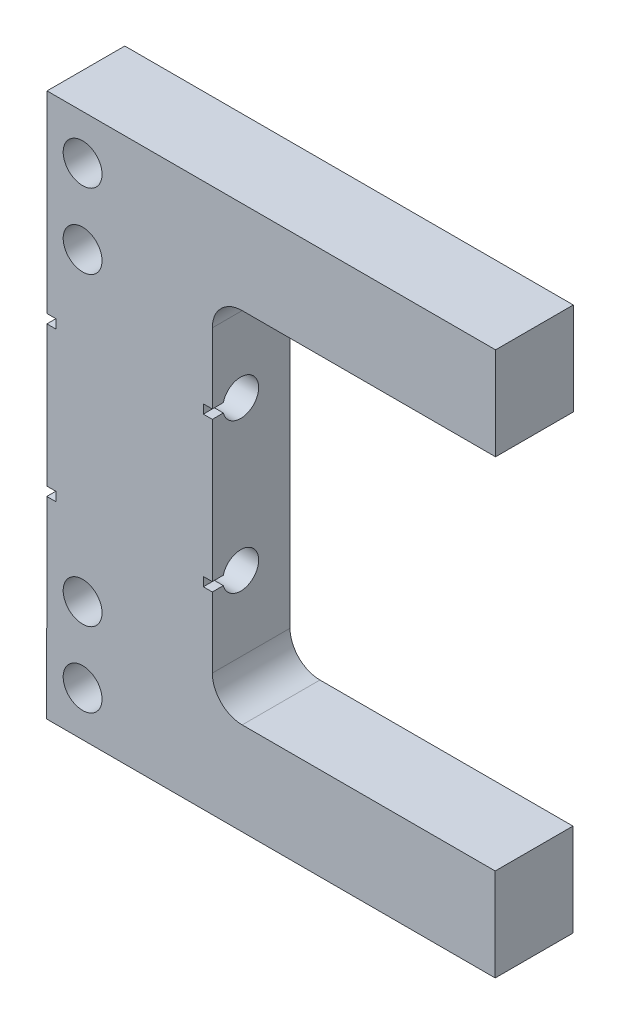
ISO-10303-21;
HEADER;
FILE_DESCRIPTION(('STEP AP214'),'2;1');
FILE_NAME('part.step','',(''),(''),'','','');
FILE_SCHEMA(('AUTOMOTIVE_DESIGN { 1 0 10303 214 1 1 1 1 }'));
ENDSEC;
DATA;
#1=APPLICATION_CONTEXT('core data for automotive mechanical design processes');
#2=APPLICATION_PROTOCOL_DEFINITION('international standard','automotive_design',2000,#1);
#3=PRODUCT_CONTEXT('',#1,'mechanical');
#4=PRODUCT('Part','Part','',(#3));
#5=PRODUCT_RELATED_PRODUCT_CATEGORY('part','',(#4));
#6=PRODUCT_DEFINITION_FORMATION('','',#4);
#7=PRODUCT_DEFINITION_CONTEXT('part definition',#1,'design');
#8=PRODUCT_DEFINITION('design','',#6,#7);
#9=PRODUCT_DEFINITION_SHAPE('','',#8);
#10=(LENGTH_UNIT() NAMED_UNIT(*) SI_UNIT(.MILLI.,.METRE.));
#11=(NAMED_UNIT(*) PLANE_ANGLE_UNIT() SI_UNIT($,.RADIAN.));
#12=(NAMED_UNIT(*) SI_UNIT($,.STERADIAN.) SOLID_ANGLE_UNIT());
#13=UNCERTAINTY_MEASURE_WITH_UNIT(LENGTH_MEASURE(1.E-05),#10,'distance_accuracy_value','');
#14=(GEOMETRIC_REPRESENTATION_CONTEXT(3) GLOBAL_UNCERTAINTY_ASSIGNED_CONTEXT((#13)) GLOBAL_UNIT_ASSIGNED_CONTEXT((#10,
#11,#12)) REPRESENTATION_CONTEXT('',''));
#15=CARTESIAN_POINT('',(0.,0.,0.));
#16=DIRECTION('',(0.,0.,1.));
#17=DIRECTION('',(1.,0.,0.));
#18=AXIS2_PLACEMENT_3D('',#15,#16,#17);
#19=CARTESIAN_POINT('',(-8.20152888113595,23.3296207262961,2.6));
#20=DIRECTION('',(0.,1.,0.));
#21=DIRECTION('',(0.,0.,1.));
#22=AXIS2_PLACEMENT_3D('',#19,#20,#21);
#23=PLANE('',#22);
#24=DIRECTION('',(1.,0.,0.));
#25=VECTOR('',#24,1.);
#26=CARTESIAN_POINT('',(-8.20152888113595,23.3296207262961,0.));
#27=LINE('',#26,#25);
#28=CARTESIAN_POINT('',(-8.20152888113595,23.3296207262961,0.));
#29=VERTEX_POINT('',#28);
#30=CARTESIAN_POINT('',(6.79847111886405,23.3296207262961,0.));
#31=VERTEX_POINT('',#30);
#32=EDGE_CURVE('E326',#29,#31,#27,.T.);
#33=ORIENTED_EDGE('',*,*,#32,.T.);
#34=DIRECTION('',(0.,0.,-1.));
#35=VECTOR('',#34,1.);
#36=CARTESIAN_POINT('',(6.79847111886405,23.3296207262961,2.6));
#37=LINE('',#36,#35);
#38=CARTESIAN_POINT('',(6.79847111886405,23.3296207262961,2.6));
#39=VERTEX_POINT('',#38);
#40=EDGE_CURVE('E432',#39,#31,#37,.T.);
#41=ORIENTED_EDGE('',*,*,#40,.F.);
#42=DIRECTION('',(1.,0.,0.));
#43=VECTOR('',#42,1.);
#44=CARTESIAN_POINT('',(-8.20152888113595,23.3296207262961,2.6));
#45=LINE('',#44,#43);
#46=CARTESIAN_POINT('',(-8.20152888113595,23.3296207262961,2.6));
#47=VERTEX_POINT('',#46);
#48=EDGE_CURVE('E356',#47,#39,#45,.T.);
#49=ORIENTED_EDGE('',*,*,#48,.F.);
#50=DIRECTION('',(0.,0.,-1.));
#51=VECTOR('',#50,1.);
#52=CARTESIAN_POINT('',(-8.20152888113595,23.3296207262961,2.6));
#53=LINE('',#52,#51);
#54=EDGE_CURVE('E386',#47,#29,#53,.T.);
#55=ORIENTED_EDGE('',*,*,#54,.T.);
#56=EDGE_LOOP('',(#33,#41,#49,#55));
#57=FACE_BOUND('',#56,.T.);
#58=ADVANCED_FACE('F36',(#57),#23,.F.);
#59=CARTESIAN_POINT('',(6.79847111886405,23.3296207262961,2.6));
#60=DIRECTION('',(-1.,0.,0.));
#61=DIRECTION('',(0.,0.,1.));
#62=AXIS2_PLACEMENT_3D('',#59,#60,#61);
#63=PLANE('',#62);
#64=DIRECTION('',(0.,1.,0.));
#65=VECTOR('',#64,1.);
#66=CARTESIAN_POINT('',(6.79847111886405,23.3296207262961,0.));
#67=LINE('',#66,#65);
#68=CARTESIAN_POINT('',(6.79847111886405,26.4296183724913,0.));
#69=VERTEX_POINT('',#68);
#70=EDGE_CURVE('E391',#31,#69,#67,.T.);
#71=ORIENTED_EDGE('',*,*,#70,.T.);
#72=DIRECTION('',(0.,0.,-1.));
#73=VECTOR('',#72,1.);
#74=CARTESIAN_POINT('',(6.79847111886405,26.4296183724913,2.6));
#75=LINE('',#74,#73);
#76=CARTESIAN_POINT('',(6.79847111886405,26.4296183724913,2.6));
#77=VERTEX_POINT('',#76);
#78=EDGE_CURVE('E428',#77,#69,#75,.T.);
#79=ORIENTED_EDGE('',*,*,#78,.F.);
#80=DIRECTION('',(0.,1.,0.));
#81=VECTOR('',#80,1.);
#82=CARTESIAN_POINT('',(6.79847111886405,23.3296207262961,2.6));
#83=LINE('',#82,#81);
#84=EDGE_CURVE('E360',#39,#77,#83,.T.);
#85=ORIENTED_EDGE('',*,*,#84,.F.);
#86=ORIENTED_EDGE('',*,*,#40,.T.);
#87=EDGE_LOOP('',(#71,#79,#85,#86));
#88=FACE_BOUND('',#87,.T.);
#89=ADVANCED_FACE('F564',(#88),#63,.F.);
#90=CARTESIAN_POINT('',(6.79847111886405,26.4296183724913,2.6));
#91=DIRECTION('',(0.,-1.,0.));
#92=DIRECTION('',(1.,0.,0.));
#93=AXIS2_PLACEMENT_3D('',#90,#91,#92);
#94=PLANE('',#93);
#95=DIRECTION('',(-1.,0.,0.));
#96=VECTOR('',#95,1.);
#97=CARTESIAN_POINT('',(6.79847111886405,26.4296183724913,0.));
#98=LINE('',#97,#96);
#99=CARTESIAN_POINT('',(-1.66324686714981,26.4296183724913,0.));
#100=VERTEX_POINT('',#99);
#101=EDGE_CURVE('E394',#69,#100,#98,.T.);
#102=ORIENTED_EDGE('',*,*,#101,.T.);
#103=DIRECTION('',(0.,0.,-1.));
#104=VECTOR('',#103,1.);
#105=CARTESIAN_POINT('',(-1.66324686714981,26.4296183724913,2.6));
#106=LINE('',#105,#104);
#107=CARTESIAN_POINT('',(-1.66324686714981,26.4296183724913,2.6));
#108=VERTEX_POINT('',#107);
#109=EDGE_CURVE('E492',#100,#108,#106,.F.);
#110=ORIENTED_EDGE('',*,*,#109,.T.);
#111=DIRECTION('',(-1.,0.,0.));
#112=VECTOR('',#111,1.);
#113=CARTESIAN_POINT('',(6.79847111886405,26.4296183724913,2.6));
#114=LINE('',#113,#112);
#115=EDGE_CURVE('E364',#77,#108,#114,.T.);
#116=ORIENTED_EDGE('',*,*,#115,.F.);
#117=ORIENTED_EDGE('',*,*,#78,.T.);
#118=EDGE_LOOP('',(#102,#110,#116,#117));
#119=FACE_BOUND('',#118,.T.);
#120=ADVANCED_FACE('F573',(#119),#94,.F.);
#121=CARTESIAN_POINT('',(-2.66324686714981,26.4296183724913,2.6));
#122=DIRECTION('',(-1.,0.,0.));
#123=DIRECTION('',(0.,0.,1.));
#124=AXIS2_PLACEMENT_3D('',#121,#122,#123);
#125=PLANE('',#124);
#126=DIRECTION('',(0.,1.,0.));
#127=VECTOR('',#126,1.);
#128=CARTESIAN_POINT('',(-2.66324686714981,26.4296183724913,2.6));
#129=LINE('',#128,#127);
#130=CARTESIAN_POINT('',(-2.66324686714981,27.4296183724913,2.6));
#131=VERTEX_POINT('',#130);
#132=CARTESIAN_POINT('',(-2.66324686714981,29.7796207262961,2.6));
#133=VERTEX_POINT('',#132);
#134=EDGE_CURVE('E234',#131,#133,#129,.T.);
#135=ORIENTED_EDGE('',*,*,#134,.F.);
#136=DIRECTION('',(0.,0.,-1.));
#137=VECTOR('',#136,1.);
#138=CARTESIAN_POINT('',(-2.66324686714981,27.4296183724913,0.));
#139=LINE('',#138,#137);
#140=CARTESIAN_POINT('',(-2.66324686714981,27.4296183724913,0.));
#141=VERTEX_POINT('',#140);
#142=EDGE_CURVE('E488',#131,#141,#139,.T.);
#143=ORIENTED_EDGE('',*,*,#142,.T.);
#144=DIRECTION('',(0.,1.,0.));
#145=VECTOR('',#144,1.);
#146=CARTESIAN_POINT('',(-2.66324686714981,26.4296183724913,0.));
#147=LINE('',#146,#145);
#148=CARTESIAN_POINT('',(-2.66324686714981,37.4296183724913,0.));
#149=VERTEX_POINT('',#148);
#150=EDGE_CURVE('E398',#141,#149,#147,.T.);
#151=ORIENTED_EDGE('',*,*,#150,.T.);
#152=DIRECTION('',(0.,0.,-1.));
#153=VECTOR('',#152,1.);
#154=CARTESIAN_POINT('',(-2.66324686714981,37.4296183724913,2.6));
#155=LINE('',#154,#153);
#156=CARTESIAN_POINT('',(-2.66324686714981,37.4296183724913,2.6));
#157=VERTEX_POINT('',#156);
#158=EDGE_CURVE('E485',#149,#157,#155,.F.);
#159=ORIENTED_EDGE('',*,*,#158,.T.);
#160=CARTESIAN_POINT('',(-2.66324686714981,35.0796207262961,2.6));
#161=VERTEX_POINT('',#160);
#162=EDGE_CURVE('E368',#161,#157,#129,.T.);
#163=ORIENTED_EDGE('',*,*,#162,.F.);
#164=DIRECTION('',(0.,0.,1.));
#165=VECTOR('',#164,1.);
#166=CARTESIAN_POINT('',(-2.66324686714981,35.0796207262961,2.6));
#167=LINE('',#166,#165);
#168=CARTESIAN_POINT('',(-2.66324686714981,35.0796207262961,2.23094750193166));
#169=VERTEX_POINT('',#168);
#170=EDGE_CURVE('E251',#169,#161,#167,.T.);
#171=ORIENTED_EDGE('',*,*,#170,.F.);
#172=CARTESIAN_POINT('',(-2.66324686714981,34.9296207262961,1.65000000000056));
#173=DIRECTION('',(1.,0.,0.));
#174=DIRECTION('',(0.,1.,0.));
#175=AXIS2_PLACEMENT_3D('',#172,#173,#174);
#176=CIRCLE('',#175,0.599999999999995);
#177=CARTESIAN_POINT('',(-2.66324686714981,34.7796207262961,2.23094750193166));
#178=VERTEX_POINT('',#177);
#179=EDGE_CURVE('E314',#178,#169,#176,.T.);
#180=ORIENTED_EDGE('',*,*,#179,.F.);
#181=DIRECTION('',(0.,0.,-1.));
#182=VECTOR('',#181,1.);
#183=CARTESIAN_POINT('',(-2.66324686714981,34.7796207262961,2.6));
#184=LINE('',#183,#182);
#185=CARTESIAN_POINT('',(-2.66324686714981,34.7796207262961,2.6));
#186=VERTEX_POINT('',#185);
#187=EDGE_CURVE('E258',#186,#178,#184,.T.);
#188=ORIENTED_EDGE('',*,*,#187,.F.);
#189=CARTESIAN_POINT('',(-2.66324686714981,30.0796207262961,2.6));
#190=VERTEX_POINT('',#189);
#191=EDGE_CURVE('E372',#190,#186,#129,.T.);
#192=ORIENTED_EDGE('',*,*,#191,.F.);
#193=DIRECTION('',(0.,0.,1.));
#194=VECTOR('',#193,1.);
#195=CARTESIAN_POINT('',(-2.66324686714981,30.0796207262961,2.6));
#196=LINE('',#195,#194);
#197=CARTESIAN_POINT('',(-2.66324686714981,30.0796207262961,2.23094750193164));
#198=VERTEX_POINT('',#197);
#199=EDGE_CURVE('E229',#198,#190,#196,.T.);
#200=ORIENTED_EDGE('',*,*,#199,.F.);
#201=CARTESIAN_POINT('',(-2.66324686714981,29.9296207262961,1.65000000000053));
#202=DIRECTION('',(1.,0.,0.));
#203=DIRECTION('',(0.,1.,0.));
#204=AXIS2_PLACEMENT_3D('',#201,#202,#203);
#205=CIRCLE('',#204,0.6);
#206=CARTESIAN_POINT('',(-2.66324686714981,29.7796207262961,2.23094750193164));
#207=VERTEX_POINT('',#206);
#208=EDGE_CURVE('E290',#207,#198,#205,.T.);
#209=ORIENTED_EDGE('',*,*,#208,.F.);
#210=DIRECTION('',(0.,0.,-1.));
#211=VECTOR('',#210,1.);
#212=CARTESIAN_POINT('',(-2.66324686714981,29.7796207262961,2.6));
#213=LINE('',#212,#211);
#214=EDGE_CURVE('E267',#133,#207,#213,.T.);
#215=ORIENTED_EDGE('',*,*,#214,.F.);
#216=EDGE_LOOP('',(#135,#143,#151,#159,#163,#171,#180,#188,#192,#200,#209,#215));
#217=FACE_BOUND('',#216,.T.);
#218=ADVANCED_FACE('F512',(#217),#125,.F.);
#219=CARTESIAN_POINT('',(-2.66324686714981,38.4296183724913,2.6));
#220=DIRECTION('',(0.,1.,0.));
#221=DIRECTION('',(0.,0.,1.));
#222=AXIS2_PLACEMENT_3D('',#219,#220,#221);
#223=PLANE('',#222);
#224=DIRECTION('',(1.,0.,0.));
#225=VECTOR('',#224,1.);
#226=CARTESIAN_POINT('',(-2.66324686714981,38.4296183724913,2.6));
#227=LINE('',#226,#225);
#228=CARTESIAN_POINT('',(-1.66324686714981,38.4296183724913,2.6));
#229=VERTEX_POINT('',#228);
#230=CARTESIAN_POINT('',(6.81032261623043,38.4296183724913,2.6));
#231=VERTEX_POINT('',#230);
#232=EDGE_CURVE('E371',#229,#231,#227,.T.);
#233=ORIENTED_EDGE('',*,*,#232,.F.);
#234=DIRECTION('',(0.,0.,-1.));
#235=VECTOR('',#234,1.);
#236=CARTESIAN_POINT('',(-1.66324686714981,38.4296183724913,0.));
#237=LINE('',#236,#235);
#238=CARTESIAN_POINT('',(-1.66324686714981,38.4296183724913,0.));
#239=VERTEX_POINT('',#238);
#240=EDGE_CURVE('E495',#229,#239,#237,.T.);
#241=ORIENTED_EDGE('',*,*,#240,.T.);
#242=DIRECTION('',(1.,0.,0.));
#243=VECTOR('',#242,1.);
#244=CARTESIAN_POINT('',(-2.66324686714981,38.4296183724913,0.));
#245=LINE('',#244,#243);
#246=CARTESIAN_POINT('',(6.81032261623043,38.4296183724913,0.));
#247=VERTEX_POINT('',#246);
#248=EDGE_CURVE('E402',#239,#247,#245,.T.);
#249=ORIENTED_EDGE('',*,*,#248,.T.);
#250=DIRECTION('',(0.,0.,-1.));
#251=VECTOR('',#250,1.);
#252=CARTESIAN_POINT('',(6.81032261623043,38.4296183724913,2.6));
#253=LINE('',#252,#251);
#254=EDGE_CURVE('E424',#231,#247,#253,.T.);
#255=ORIENTED_EDGE('',*,*,#254,.F.);
#256=EDGE_LOOP('',(#233,#241,#249,#255));
#257=FACE_BOUND('',#256,.T.);
#258=ADVANCED_FACE('F516',(#257),#223,.F.);
#259=CARTESIAN_POINT('',(6.81032261623043,38.4296183724913,2.6));
#260=DIRECTION('',(-1.,0.,0.));
#261=DIRECTION('',(0.,0.,1.));
#262=AXIS2_PLACEMENT_3D('',#259,#260,#261);
#263=PLANE('',#262);
#264=DIRECTION('',(0.,1.,0.));
#265=VECTOR('',#264,1.);
#266=CARTESIAN_POINT('',(6.81032261623043,38.4296183724913,0.));
#267=LINE('',#266,#265);
#268=CARTESIAN_POINT('',(6.81032261623043,41.5296207262961,0.));
#269=VERTEX_POINT('',#268);
#270=EDGE_CURVE('E405',#247,#269,#267,.T.);
#271=ORIENTED_EDGE('',*,*,#270,.T.);
#272=DIRECTION('',(0.,0.,-1.));
#273=VECTOR('',#272,1.);
#274=CARTESIAN_POINT('',(6.81032261623043,41.5296207262961,2.6));
#275=LINE('',#274,#273);
#276=CARTESIAN_POINT('',(6.81032261623043,41.5296207262961,2.6));
#277=VERTEX_POINT('',#276);
#278=EDGE_CURVE('E420',#277,#269,#275,.T.);
#279=ORIENTED_EDGE('',*,*,#278,.F.);
#280=DIRECTION('',(0.,1.,0.));
#281=VECTOR('',#280,1.);
#282=CARTESIAN_POINT('',(6.81032261623043,38.4296183724913,2.6));
#283=LINE('',#282,#281);
#284=EDGE_CURVE('E375',#231,#277,#283,.T.);
#285=ORIENTED_EDGE('',*,*,#284,.F.);
#286=ORIENTED_EDGE('',*,*,#254,.T.);
#287=EDGE_LOOP('',(#271,#279,#285,#286));
#288=FACE_BOUND('',#287,.T.);
#289=ADVANCED_FACE('F523',(#288),#263,.F.);
#290=CARTESIAN_POINT('',(6.81032261623043,41.5296207262961,2.6));
#291=DIRECTION('',(0.,-1.,0.));
#292=DIRECTION('',(0.,0.,-1.));
#293=AXIS2_PLACEMENT_3D('',#290,#291,#292);
#294=PLANE('',#293);
#295=DIRECTION('',(-1.,0.,0.));
#296=VECTOR('',#295,1.);
#297=CARTESIAN_POINT('',(6.81032261623043,41.5296207262961,0.));
#298=LINE('',#297,#296);
#299=CARTESIAN_POINT('',(-8.18967738376956,41.5296207262961,0.));
#300=VERTEX_POINT('',#299);
#301=EDGE_CURVE('E408',#269,#300,#298,.T.);
#302=ORIENTED_EDGE('',*,*,#301,.T.);
#303=DIRECTION('',(0.,0.,-1.));
#304=VECTOR('',#303,1.);
#305=CARTESIAN_POINT('',(-8.18967738376956,41.5296207262961,2.6));
#306=LINE('',#305,#304);
#307=CARTESIAN_POINT('',(-8.18967738376956,41.5296207262961,2.6));
#308=VERTEX_POINT('',#307);
#309=EDGE_CURVE('E416',#308,#300,#306,.T.);
#310=ORIENTED_EDGE('',*,*,#309,.F.);
#311=DIRECTION('',(-1.,0.,0.));
#312=VECTOR('',#311,1.);
#313=CARTESIAN_POINT('',(6.81032261623043,41.5296207262961,2.6));
#314=LINE('',#313,#312);
#315=EDGE_CURVE('E378',#277,#308,#314,.T.);
#316=ORIENTED_EDGE('',*,*,#315,.F.);
#317=ORIENTED_EDGE('',*,*,#278,.T.);
#318=EDGE_LOOP('',(#302,#310,#316,#317));
#319=FACE_BOUND('',#318,.T.);
#320=ADVANCED_FACE('F526',(#319),#294,.F.);
#321=CARTESIAN_POINT('',(-8.18967738376956,41.5296207262961,2.6));
#322=DIRECTION('',(0.999999787981607,-0.000651181035914779,0.));
#323=DIRECTION('',(0.000651181035914779,0.999999787981607,0.));
#324=AXIS2_PLACEMENT_3D('',#321,#322,#323);
#325=PLANE('',#324);
#326=CARTESIAN_POINT('',(-8.19397517951781,34.9296207262961,1.65000000000056));
#327=DIRECTION('',(0.999999787981607,-0.000651181035914779,0.));
#328=DIRECTION('',(0.000651181035914779,0.999999787981607,0.));
#329=AXIS2_PLACEMENT_3D('',#326,#327,#328);
#330=ELLIPSE('',#329,0.600000127211058,0.599999999999995);
#331=CARTESIAN_POINT('',(-8.19407285576199,34.7796221574203,2.23094787144445));
#332=VERTEX_POINT('',#331);
#333=CARTESIAN_POINT('',(-8.19387750145122,35.0796220938148,2.23094714883815));
#334=VERTEX_POINT('',#333);
#335=EDGE_CURVE('E341',#332,#334,#330,.T.);
#336=ORIENTED_EDGE('',*,*,#335,.T.);
#337=DIRECTION('',(0.,0.,-1.));
#338=VECTOR('',#337,1.);
#339=CARTESIAN_POINT('',(-8.19387750145122,35.0796220938148,2.2));
#340=LINE('',#339,#338);
#341=CARTESIAN_POINT('',(-8.19387750145122,35.0796220938147,2.6));
#342=VERTEX_POINT('',#341);
#343=EDGE_CURVE('E274',#342,#334,#340,.T.);
#344=ORIENTED_EDGE('',*,*,#343,.F.);
#345=DIRECTION('',(-0.000651181035914779,-0.999999787981607,0.));
#346=VECTOR('',#345,1.);
#347=CARTESIAN_POINT('',(-8.18967738376956,41.5296207262961,2.6));
#348=LINE('',#347,#346);
#349=EDGE_CURVE('E382',#308,#342,#348,.T.);
#350=ORIENTED_EDGE('',*,*,#349,.F.);
#351=ORIENTED_EDGE('',*,*,#309,.T.);
#352=DIRECTION('',(-0.000651181035914779,-0.999999787981607,0.));
#353=VECTOR('',#352,1.);
#354=CARTESIAN_POINT('',(-8.18967738376956,41.5296207262961,0.));
#355=LINE('',#354,#353);
#356=EDGE_CURVE('E361',#300,#29,#355,.T.);
#357=ORIENTED_EDGE('',*,*,#356,.T.);
#358=ORIENTED_EDGE('',*,*,#54,.F.);
#359=CARTESIAN_POINT('',(-8.19732876094157,29.7796232175122,2.6));
#360=VERTEX_POINT('',#359);
#361=EDGE_CURVE('E381',#360,#47,#348,.T.);
#362=ORIENTED_EDGE('',*,*,#361,.F.);
#363=DIRECTION('',(0.,0.,1.));
#364=VECTOR('',#363,1.);
#365=CARTESIAN_POINT('',(-8.19732876094157,29.7796232175122,2.2));
#366=LINE('',#365,#364);
#367=CARTESIAN_POINT('',(-8.19732876094157,29.7796232175122,2.23094814515518));
#368=VERTEX_POINT('',#367);
#369=EDGE_CURVE('E241',#368,#360,#366,.T.);
#370=ORIENTED_EDGE('',*,*,#369,.F.);
#371=CARTESIAN_POINT('',(-8.1972310853877,29.9296207262961,1.65000000000053));
#372=DIRECTION('',(0.999999787981607,-0.000651181035914779,0.));
#373=DIRECTION('',(0.000651181035914779,0.999999787981607,0.));
#374=AXIS2_PLACEMENT_3D('',#371,#372,#373);
#375=ELLIPSE('',#374,0.600000127211063,0.6);
#376=CARTESIAN_POINT('',(-8.19713340663079,30.0796231539067,2.23094687511987));
#377=VERTEX_POINT('',#376);
#378=EDGE_CURVE('E318',#368,#377,#375,.T.);
#379=ORIENTED_EDGE('',*,*,#378,.T.);
#380=DIRECTION('',(0.,0.,-1.));
#381=VECTOR('',#380,1.);
#382=CARTESIAN_POINT('',(-8.19713340663079,30.0796231539067,2.2));
#383=LINE('',#382,#381);
#384=CARTESIAN_POINT('',(-8.19713340663079,30.0796231539067,2.6));
#385=VERTEX_POINT('',#384);
#386=EDGE_CURVE('E298',#385,#377,#383,.T.);
#387=ORIENTED_EDGE('',*,*,#386,.F.);
#388=CARTESIAN_POINT('',(-8.19407285576199,34.7796221574203,2.6));
#389=VERTEX_POINT('',#388);
#390=EDGE_CURVE('E387',#389,#385,#348,.T.);
#391=ORIENTED_EDGE('',*,*,#390,.F.);
#392=DIRECTION('',(0.,0.,1.));
#393=VECTOR('',#392,1.);
#394=CARTESIAN_POINT('',(-8.19407285576199,34.7796221574203,2.2));
#395=LINE('',#394,#393);
#396=EDGE_CURVE('E281',#332,#389,#395,.T.);
#397=ORIENTED_EDGE('',*,*,#396,.F.);
#398=EDGE_LOOP('',(#336,#344,#350,#351,#357,#358,#362,#370,#379,#387,#391,#397));
#399=FACE_BOUND('',#398,.T.);
#400=ADVANCED_FACE('F531',(#399),#325,.F.);
#401=CARTESIAN_POINT('',(0.,0.,2.6));
#402=DIRECTION('',(0.,0.,1.));
#403=DIRECTION('',(1.,0.,0.));
#404=AXIS2_PLACEMENT_3D('',#401,#402,#403);
#405=PLANE('',#404);
#406=DIRECTION('',(1.,0.,0.));
#407=VECTOR('',#406,1.);
#408=CARTESIAN_POINT('',(-2.96324686714981,30.0796207262961,2.6));
#409=LINE('',#408,#407);
#410=CARTESIAN_POINT('',(-2.96324686714981,30.0796207262961,2.6));
#411=VERTEX_POINT('',#410);
#412=EDGE_CURVE('E236',#411,#190,#409,.T.);
#413=ORIENTED_EDGE('',*,*,#412,.T.);
#414=ORIENTED_EDGE('',*,*,#191,.T.);
#415=DIRECTION('',(1.,0.,0.));
#416=VECTOR('',#415,1.);
#417=CARTESIAN_POINT('',(-2.96324686714981,34.7796207262961,2.6));
#418=LINE('',#417,#416);
#419=CARTESIAN_POINT('',(-2.96324686714981,34.7796207262961,2.6));
#420=VERTEX_POINT('',#419);
#421=EDGE_CURVE('E257',#420,#186,#418,.T.);
#422=ORIENTED_EDGE('',*,*,#421,.F.);
#423=DIRECTION('',(0.,-1.,0.));
#424=VECTOR('',#423,1.);
#425=CARTESIAN_POINT('',(-2.96324686714981,34.7796207262961,2.6));
#426=LINE('',#425,#424);
#427=CARTESIAN_POINT('',(-2.96324686714981,35.0796207262961,2.6));
#428=VERTEX_POINT('',#427);
#429=EDGE_CURVE('E246',#428,#420,#426,.T.);
#430=ORIENTED_EDGE('',*,*,#429,.F.);
#431=DIRECTION('',(1.,0.,0.));
#432=VECTOR('',#431,1.);
#433=CARTESIAN_POINT('',(-2.96324686714981,35.0796207262961,2.6));
#434=LINE('',#433,#432);
#435=EDGE_CURVE('E263',#428,#161,#434,.T.);
#436=ORIENTED_EDGE('',*,*,#435,.T.);
#437=ORIENTED_EDGE('',*,*,#162,.T.);
#438=CARTESIAN_POINT('',(-1.66324686714981,37.4296183724913,2.6));
#439=DIRECTION('',(0.,0.,1.));
#440=DIRECTION('',(1.,0.,0.));
#441=AXIS2_PLACEMENT_3D('',#438,#439,#440);
#442=CIRCLE('',#441,1.);
#443=EDGE_CURVE('E11',#157,#229,#442,.F.);
#444=ORIENTED_EDGE('',*,*,#443,.T.);
#445=ORIENTED_EDGE('',*,*,#232,.T.);
#446=ORIENTED_EDGE('',*,*,#284,.T.);
#447=ORIENTED_EDGE('',*,*,#315,.T.);
#448=ORIENTED_EDGE('',*,*,#349,.T.);
#449=DIRECTION('',(-0.999999787981607,0.000651181035914779,0.));
#450=VECTOR('',#449,1.);
#451=CARTESIAN_POINT('',(-7.89387756505674,35.079426739504,2.6));
#452=LINE('',#451,#450);
#453=CARTESIAN_POINT('',(-7.89387756505674,35.079426739504,2.6));
#454=VERTEX_POINT('',#453);
#455=EDGE_CURVE('E287',#454,#342,#452,.T.);
#456=ORIENTED_EDGE('',*,*,#455,.F.);
#457=DIRECTION('',(0.000651181035916267,0.999999787981607,0.));
#458=VECTOR('',#457,1.);
#459=CARTESIAN_POINT('',(-7.89387756505674,35.079426739504,2.6));
#460=LINE('',#459,#458);
#461=CARTESIAN_POINT('',(-7.89407291936751,34.7794268031095,2.6));
#462=VERTEX_POINT('',#461);
#463=EDGE_CURVE('E273',#462,#454,#460,.T.);
#464=ORIENTED_EDGE('',*,*,#463,.F.);
#465=DIRECTION('',(-0.999999787981607,0.000651181035914779,0.));
#466=VECTOR('',#465,1.);
#467=CARTESIAN_POINT('',(-7.89407291936751,34.7794268031095,2.6));
#468=LINE('',#467,#466);
#469=EDGE_CURVE('E280',#462,#389,#468,.T.);
#470=ORIENTED_EDGE('',*,*,#469,.T.);
#471=ORIENTED_EDGE('',*,*,#390,.T.);
#472=DIRECTION('',(-0.999999787981607,0.000651181035914779,0.));
#473=VECTOR('',#472,1.);
#474=CARTESIAN_POINT('',(-7.89713347023631,30.0794277995959,2.6));
#475=LINE('',#474,#473);
#476=CARTESIAN_POINT('',(-7.89713347023631,30.0794277995959,2.6));
#477=VERTEX_POINT('',#476);
#478=EDGE_CURVE('E284',#477,#385,#475,.T.);
#479=ORIENTED_EDGE('',*,*,#478,.F.);
#480=DIRECTION('',(0.000651181035916236,0.999999787981607,0.));
#481=VECTOR('',#480,1.);
#482=CARTESIAN_POINT('',(-7.89713347023631,30.0794277995959,2.6));
#483=LINE('',#482,#481);
#484=CARTESIAN_POINT('',(-7.89732882454709,29.7794278632015,2.6));
#485=VERTEX_POINT('',#484);
#486=EDGE_CURVE('E297',#485,#477,#483,.T.);
#487=ORIENTED_EDGE('',*,*,#486,.F.);
#488=DIRECTION('',(-0.999999787981607,0.000651181035914779,0.));
#489=VECTOR('',#488,1.);
#490=CARTESIAN_POINT('',(-7.89732882454709,29.7794278632015,2.6));
#491=LINE('',#490,#489);
#492=EDGE_CURVE('E304',#485,#360,#491,.T.);
#493=ORIENTED_EDGE('',*,*,#492,.T.);
#494=ORIENTED_EDGE('',*,*,#361,.T.);
#495=ORIENTED_EDGE('',*,*,#48,.T.);
#496=ORIENTED_EDGE('',*,*,#84,.T.);
#497=ORIENTED_EDGE('',*,*,#115,.T.);
#498=CARTESIAN_POINT('',(-1.66324686714981,27.4296183724913,2.6));
#499=DIRECTION('',(0.,0.,1.));
#500=DIRECTION('',(1.,0.,0.));
#501=AXIS2_PLACEMENT_3D('',#498,#499,#500);
#502=CIRCLE('',#501,1.);
#503=EDGE_CURVE('E501',#108,#131,#502,.F.);
#504=ORIENTED_EDGE('',*,*,#503,.T.);
#505=ORIENTED_EDGE('',*,*,#134,.T.);
#506=DIRECTION('',(1.,0.,0.));
#507=VECTOR('',#506,1.);
#508=CARTESIAN_POINT('',(-2.96324686714981,29.7796207262961,2.6));
#509=LINE('',#508,#507);
#510=CARTESIAN_POINT('',(-2.96324686714981,29.7796207262961,2.6));
#511=VERTEX_POINT('',#510);
#512=EDGE_CURVE('E213',#511,#133,#509,.T.);
#513=ORIENTED_EDGE('',*,*,#512,.F.);
#514=DIRECTION('',(0.,-1.,0.));
#515=VECTOR('',#514,1.);
#516=CARTESIAN_POINT('',(-2.96324686714981,29.7796207262961,2.6));
#517=LINE('',#516,#515);
#518=EDGE_CURVE('E221',#411,#511,#517,.T.);
#519=ORIENTED_EDGE('',*,*,#518,.F.);
#520=EDGE_LOOP('',(#413,#414,#422,#430,#436,#437,#444,#445,#446,#447,#448,#456,#464,#470,#471,
#479,#487,#493,#494,#495,#496,#497,#504,#505,#513,#519));
#521=FACE_BOUND('',#520,.T.);
#522=CARTESIAN_POINT('',(-7.00055210937498,24.8296207262961,2.6));
#523=DIRECTION('',(0.,0.,1.));
#524=DIRECTION('',(1.,0.,0.));
#525=AXIS2_PLACEMENT_3D('',#522,#523,#524);
#526=CIRCLE('',#525,0.65);
#527=CARTESIAN_POINT('',(-6.35055210937498,24.8296207262961,2.6));
#528=VERTEX_POINT('',#527);
#529=EDGE_CURVE('E327',#528,#528,#526,.T.);
#530=ORIENTED_EDGE('',*,*,#529,.F.);
#531=EDGE_LOOP('',(#530));
#532=FACE_BOUND('',#531,.T.);
#533=CARTESIAN_POINT('',(-7.00055210937499,37.5296207262961,2.6));
#534=DIRECTION('',(0.,0.,1.));
#535=DIRECTION('',(1.,0.,0.));
#536=AXIS2_PLACEMENT_3D('',#533,#534,#535);
#537=CIRCLE('',#536,0.649999999999999);
#538=CARTESIAN_POINT('',(-6.35055210937499,37.5296207262961,2.6));
#539=VERTEX_POINT('',#538);
#540=EDGE_CURVE('E337',#539,#539,#537,.T.);
#541=ORIENTED_EDGE('',*,*,#540,.F.);
#542=EDGE_LOOP('',(#541));
#543=FACE_BOUND('',#542,.T.);
#544=CARTESIAN_POINT('',(-7.00055210937499,40.0296207262961,2.6));
#545=DIRECTION('',(0.,0.,1.));
#546=DIRECTION('',(1.,0.,0.));
#547=AXIS2_PLACEMENT_3D('',#544,#545,#546);
#548=CIRCLE('',#547,0.649999999999999);
#549=CARTESIAN_POINT('',(-6.35055210937499,40.0296207262961,2.6));
#550=VERTEX_POINT('',#549);
#551=EDGE_CURVE('E336',#550,#550,#548,.T.);
#552=ORIENTED_EDGE('',*,*,#551,.F.);
#553=EDGE_LOOP('',(#552));
#554=FACE_BOUND('',#553,.T.);
#555=CARTESIAN_POINT('',(-7.00055210937498,27.3296207262961,2.6));
#556=DIRECTION('',(0.,0.,1.));
#557=DIRECTION('',(1.,0.,0.));
#558=AXIS2_PLACEMENT_3D('',#555,#556,#557);
#559=CIRCLE('',#558,0.65);
#560=CARTESIAN_POINT('',(-6.35055210937498,27.3296207262961,2.6));
#561=VERTEX_POINT('',#560);
#562=EDGE_CURVE('E345',#561,#561,#559,.T.);
#563=ORIENTED_EDGE('',*,*,#562,.F.);
#564=EDGE_LOOP('',(#563));
#565=FACE_BOUND('',#564,.T.);
#566=ADVANCED_FACE('F231',(#521,#532,#543,#554,#565),#405,.T.);
#567=CARTESIAN_POINT('',(0.,0.,0.));
#568=DIRECTION('',(0.,0.,1.));
#569=DIRECTION('',(1.,0.,0.));
#570=AXIS2_PLACEMENT_3D('',#567,#568,#569);
#571=PLANE('',#570);
#572=CARTESIAN_POINT('',(-7.00055210937498,24.8296207262961,0.));
#573=DIRECTION('',(0.,0.,1.));
#574=DIRECTION('',(1.,0.,0.));
#575=AXIS2_PLACEMENT_3D('',#572,#573,#574);
#576=CIRCLE('',#575,0.65);
#577=CARTESIAN_POINT('',(-6.35055210937498,24.8296207262961,0.));
#578=VERTEX_POINT('',#577);
#579=EDGE_CURVE('E322',#578,#578,#576,.T.);
#580=ORIENTED_EDGE('',*,*,#579,.T.);
#581=EDGE_LOOP('',(#580));
#582=FACE_BOUND('',#581,.T.);
#583=CARTESIAN_POINT('',(-7.00055210937499,37.5296207262961,0.));
#584=DIRECTION('',(0.,0.,1.));
#585=DIRECTION('',(1.,0.,0.));
#586=AXIS2_PLACEMENT_3D('',#583,#584,#585);
#587=CIRCLE('',#586,0.649999999999999);
#588=CARTESIAN_POINT('',(-6.35055210937499,37.5296207262961,0.));
#589=VERTEX_POINT('',#588);
#590=EDGE_CURVE('E332',#589,#589,#587,.T.);
#591=ORIENTED_EDGE('',*,*,#590,.T.);
#592=EDGE_LOOP('',(#591));
#593=FACE_BOUND('',#592,.T.);
#594=CARTESIAN_POINT('',(-7.00055210937499,40.0296207262961,0.));
#595=DIRECTION('',(0.,0.,1.));
#596=DIRECTION('',(1.,0.,0.));
#597=AXIS2_PLACEMENT_3D('',#594,#595,#596);
#598=CIRCLE('',#597,0.649999999999999);
#599=CARTESIAN_POINT('',(-6.35055210937499,40.0296207262961,0.));
#600=VERTEX_POINT('',#599);
#601=EDGE_CURVE('E349',#600,#600,#598,.T.);
#602=ORIENTED_EDGE('',*,*,#601,.T.);
#603=EDGE_LOOP('',(#602));
#604=FACE_BOUND('',#603,.T.);
#605=CARTESIAN_POINT('',(-7.00055210937498,27.3296207262961,0.));
#606=DIRECTION('',(0.,0.,1.));
#607=DIRECTION('',(1.,0.,0.));
#608=AXIS2_PLACEMENT_3D('',#605,#606,#607);
#609=CIRCLE('',#608,0.65);
#610=CARTESIAN_POINT('',(-6.35055210937498,27.3296207262961,0.));
#611=VERTEX_POINT('',#610);
#612=EDGE_CURVE('E331',#611,#611,#609,.T.);
#613=ORIENTED_EDGE('',*,*,#612,.T.);
#614=EDGE_LOOP('',(#613));
#615=FACE_BOUND('',#614,.T.);
#616=ORIENTED_EDGE('',*,*,#32,.F.);
#617=ORIENTED_EDGE('',*,*,#356,.F.);
#618=ORIENTED_EDGE('',*,*,#301,.F.);
#619=ORIENTED_EDGE('',*,*,#270,.F.);
#620=ORIENTED_EDGE('',*,*,#248,.F.);
#621=CARTESIAN_POINT('',(-1.66324686714981,37.4296183724913,0.));
#622=DIRECTION('',(0.,0.,1.));
#623=DIRECTION('',(1.,0.,0.));
#624=AXIS2_PLACEMENT_3D('',#621,#622,#623);
#625=CIRCLE('',#624,1.);
#626=EDGE_CURVE('E45',#239,#149,#625,.T.);
#627=ORIENTED_EDGE('',*,*,#626,.T.);
#628=ORIENTED_EDGE('',*,*,#150,.F.);
#629=CARTESIAN_POINT('',(-1.66324686714981,27.4296183724913,0.));
#630=DIRECTION('',(0.,0.,1.));
#631=DIRECTION('',(1.,0.,0.));
#632=AXIS2_PLACEMENT_3D('',#629,#630,#631);
#633=CIRCLE('',#632,1.);
#634=EDGE_CURVE('E498',#141,#100,#633,.T.);
#635=ORIENTED_EDGE('',*,*,#634,.T.);
#636=ORIENTED_EDGE('',*,*,#101,.F.);
#637=ORIENTED_EDGE('',*,*,#70,.F.);
#638=EDGE_LOOP('',(#616,#617,#618,#619,#620,#627,#628,#635,#636,#637));
#639=FACE_BOUND('',#638,.T.);
#640=ADVANCED_FACE('F509',(#582,#593,#604,#615,#639),#571,.F.);
#641=CARTESIAN_POINT('',(-7.00055210937498,27.3296207262961,0.));
#642=DIRECTION('',(0.,0.,1.));
#643=DIRECTION('',(1.,0.,0.));
#644=AXIS2_PLACEMENT_3D('',#641,#642,#643);
#645=CYLINDRICAL_SURFACE('',#644,0.65);
#646=ORIENTED_EDGE('',*,*,#612,.F.);
#647=EDGE_LOOP('',(#646));
#648=FACE_BOUND('',#647,.T.);
#649=ORIENTED_EDGE('',*,*,#562,.T.);
#650=EDGE_LOOP('',(#649));
#651=FACE_BOUND('',#650,.T.);
#652=ADVANCED_FACE('F648',(#648,#651),#645,.F.);
#653=CARTESIAN_POINT('',(-7.00055210937499,40.0296207262961,0.));
#654=DIRECTION('',(0.,0.,1.));
#655=DIRECTION('',(1.,0.,0.));
#656=AXIS2_PLACEMENT_3D('',#653,#654,#655);
#657=CYLINDRICAL_SURFACE('',#656,0.649999999999999);
#658=ORIENTED_EDGE('',*,*,#601,.F.);
#659=EDGE_LOOP('',(#658));
#660=FACE_BOUND('',#659,.T.);
#661=ORIENTED_EDGE('',*,*,#551,.T.);
#662=EDGE_LOOP('',(#661));
#663=FACE_BOUND('',#662,.T.);
#664=ADVANCED_FACE('F646',(#660,#663),#657,.F.);
#665=CARTESIAN_POINT('',(-7.00055210937499,37.5296207262961,0.));
#666=DIRECTION('',(0.,0.,1.));
#667=DIRECTION('',(1.,0.,0.));
#668=AXIS2_PLACEMENT_3D('',#665,#666,#667);
#669=CYLINDRICAL_SURFACE('',#668,0.649999999999999);
#670=ORIENTED_EDGE('',*,*,#590,.F.);
#671=EDGE_LOOP('',(#670));
#672=FACE_BOUND('',#671,.T.);
#673=ORIENTED_EDGE('',*,*,#540,.T.);
#674=EDGE_LOOP('',(#673));
#675=FACE_BOUND('',#674,.T.);
#676=ADVANCED_FACE('F642',(#672,#675),#669,.F.);
#677=CARTESIAN_POINT('',(-7.00055210937498,24.8296207262961,0.));
#678=DIRECTION('',(0.,0.,1.));
#679=DIRECTION('',(1.,0.,0.));
#680=AXIS2_PLACEMENT_3D('',#677,#678,#679);
#681=CYLINDRICAL_SURFACE('',#680,0.65);
#682=ORIENTED_EDGE('',*,*,#579,.F.);
#683=EDGE_LOOP('',(#682));
#684=FACE_BOUND('',#683,.T.);
#685=ORIENTED_EDGE('',*,*,#529,.T.);
#686=EDGE_LOOP('',(#685));
#687=FACE_BOUND('',#686,.T.);
#688=ADVANCED_FACE('F638',(#684,#687),#681,.F.);
#689=CARTESIAN_POINT('',(-8.20152888113595,29.9296207262961,1.65000000000053));
#690=DIRECTION('',(1.,0.,0.));
#691=DIRECTION('',(0.,1.,0.));
#692=AXIS2_PLACEMENT_3D('',#689,#690,#691);
#693=CYLINDRICAL_SURFACE('',#692,0.6);
#694=ORIENTED_EDGE('',*,*,#208,.T.);
#695=DIRECTION('',(1.,0.,0.));
#696=VECTOR('',#695,1.);
#697=CARTESIAN_POINT('',(-8.20152888113595,30.0796207262961,2.23094750193164));
#698=LINE('',#697,#696);
#699=CARTESIAN_POINT('',(-2.96324686714981,30.0796207262961,2.23094750193164));
#700=VERTEX_POINT('',#699);
#701=EDGE_CURVE('E481',#198,#700,#698,.F.);
#702=ORIENTED_EDGE('',*,*,#701,.T.);
#703=CARTESIAN_POINT('',(-2.96324686714981,29.9296207262961,1.65000000000053));
#704=DIRECTION('',(-1.,0.,0.));
#705=DIRECTION('',(0.,0.,1.));
#706=AXIS2_PLACEMENT_3D('',#703,#704,#705);
#707=CIRCLE('',#706,0.6);
#708=CARTESIAN_POINT('',(-2.96324686714981,29.7796207262961,2.23094750193164));
#709=VERTEX_POINT('',#708);
#710=EDGE_CURVE('E476',#700,#709,#707,.F.);
#711=ORIENTED_EDGE('',*,*,#710,.T.);
#712=DIRECTION('',(1.,0.,0.));
#713=VECTOR('',#712,1.);
#714=CARTESIAN_POINT('',(-8.20152888113595,29.7796207262961,2.23094750193164));
#715=LINE('',#714,#713);
#716=EDGE_CURVE('E216',#709,#207,#715,.T.);
#717=ORIENTED_EDGE('',*,*,#716,.T.);
#718=EDGE_LOOP('',(#694,#702,#711,#717));
#719=FACE_BOUND('',#718,.T.);
#720=CARTESIAN_POINT('',(-7.89723102178217,29.9296207262961,1.65000000000053));
#721=DIRECTION('',(-0.999999787981607,0.000651181035916236,0.));
#722=DIRECTION('',(0.000651181035916236,0.999999787981607,0.));
#723=AXIS2_PLACEMENT_3D('',#720,#721,#722);
#724=ELLIPSE('',#723,0.600000127211063,0.6);
#725=CARTESIAN_POINT('',(-7.89713347023631,30.0794277995959,2.23099728122423));
#726=VERTEX_POINT('',#725);
#727=CARTESIAN_POINT('',(-7.89732882454709,29.7794278632015,2.2308976707442));
#728=VERTEX_POINT('',#727);
#729=EDGE_CURVE('E453',#726,#728,#724,.F.);
#730=ORIENTED_EDGE('',*,*,#729,.F.);
#731=CARTESIAN_POINT('',(222.157234325517,29.9296207262961,1.65000000000053));
#732=DIRECTION('',(0.000651181035914779,0.999999787981607,0.));
#733=DIRECTION('',(0.999999787981607,-0.000651181035914779,0.));
#734=AXIS2_PLACEMENT_3D('',#731,#732,#733);
#735=ELLIPSE('',#734,921.40275423875,0.6);
#736=EDGE_CURVE('E460',#726,#377,#735,.F.);
#737=ORIENTED_EDGE('',*,*,#736,.T.);
#738=ORIENTED_EDGE('',*,*,#378,.F.);
#739=CARTESIAN_POINT('',(-238.544142793863,29.9296207262961,1.65000000000053));
#740=DIRECTION('',(-0.000651181035914779,-0.999999787981607,0.));
#741=DIRECTION('',(0.999999787981607,-0.000651181035914779,0.));
#742=AXIS2_PLACEMENT_3D('',#739,#740,#741);
#743=ELLIPSE('',#742,921.40275423875,0.6);
#744=EDGE_CURVE('E456',#368,#728,#743,.F.);
#745=ORIENTED_EDGE('',*,*,#744,.T.);
#746=EDGE_LOOP('',(#730,#737,#738,#745));
#747=FACE_BOUND('',#746,.T.);
#748=ADVANCED_FACE('F634',(#719,#747),#693,.F.);
#749=CARTESIAN_POINT('',(-8.20152888113595,34.9296207262961,1.65000000000056));
#750=DIRECTION('',(1.,0.,0.));
#751=DIRECTION('',(0.,1.,0.));
#752=AXIS2_PLACEMENT_3D('',#749,#750,#751);
#753=CYLINDRICAL_SURFACE('',#752,0.599999999999995);
#754=ORIENTED_EDGE('',*,*,#179,.T.);
#755=DIRECTION('',(1.,0.,0.));
#756=VECTOR('',#755,1.);
#757=CARTESIAN_POINT('',(-8.20152888113595,35.0796207262961,2.23094750193166));
#758=LINE('',#757,#756);
#759=CARTESIAN_POINT('',(-2.96324686714981,35.0796207262961,2.23094750193166));
#760=VERTEX_POINT('',#759);
#761=EDGE_CURVE('E472',#169,#760,#758,.F.);
#762=ORIENTED_EDGE('',*,*,#761,.T.);
#763=CARTESIAN_POINT('',(-2.96324686714981,34.9296207262961,1.65000000000056));
#764=DIRECTION('',(-1.,0.,0.));
#765=DIRECTION('',(0.,0.,1.));
#766=AXIS2_PLACEMENT_3D('',#763,#764,#765);
#767=CIRCLE('',#766,0.599999999999995);
#768=CARTESIAN_POINT('',(-2.96324686714981,34.7796207262961,2.23094750193166));
#769=VERTEX_POINT('',#768);
#770=EDGE_CURVE('E464',#760,#769,#767,.F.);
#771=ORIENTED_EDGE('',*,*,#770,.T.);
#772=DIRECTION('',(1.,0.,0.));
#773=VECTOR('',#772,1.);
#774=CARTESIAN_POINT('',(-8.20152888113595,34.7796207262961,2.23094750193166));
#775=LINE('',#774,#773);
#776=EDGE_CURVE('E468',#769,#178,#775,.T.);
#777=ORIENTED_EDGE('',*,*,#776,.T.);
#778=EDGE_LOOP('',(#754,#762,#771,#777));
#779=FACE_BOUND('',#778,.T.);
#780=CARTESIAN_POINT('',(-7.89397511591229,34.9296207262961,1.65000000000056));
#781=DIRECTION('',(-0.999999787981607,0.000651181035916252,0.));
#782=DIRECTION('',(0.000651181035916252,0.999999787981607,0.));
#783=AXIS2_PLACEMENT_3D('',#780,#781,#782);
#784=ELLIPSE('',#783,0.600000127211058,0.599999999999995);
#785=CARTESIAN_POINT('',(-7.89387756505674,35.079426739504,2.23099755456233));
#786=VERTEX_POINT('',#785);
#787=CARTESIAN_POINT('',(-7.89407291936751,34.7794268031095,2.23089739665319));
#788=VERTEX_POINT('',#787);
#789=EDGE_CURVE('E436',#786,#788,#784,.F.);
#790=ORIENTED_EDGE('',*,*,#789,.F.);
#791=CARTESIAN_POINT('',(222.158862278295,34.9296207262961,1.65000000000056));
#792=DIRECTION('',(0.000651181035914779,0.999999787981607,0.));
#793=DIRECTION('',(0.999999787981607,-0.000651181035914779,0.));
#794=AXIS2_PLACEMENT_3D('',#791,#792,#793);
#795=ELLIPSE('',#794,921.402754238743,0.599999999999995);
#796=EDGE_CURVE('E449',#786,#334,#795,.F.);
#797=ORIENTED_EDGE('',*,*,#796,.T.);
#798=ORIENTED_EDGE('',*,*,#335,.F.);
#799=CARTESIAN_POINT('',(-238.542514841089,34.9296207262961,1.65000000000056));
#800=DIRECTION('',(-0.000651181035914779,-0.999999787981607,0.));
#801=DIRECTION('',(0.999999787981607,-0.000651181035914779,0.));
#802=AXIS2_PLACEMENT_3D('',#799,#800,#801);
#803=ELLIPSE('',#802,921.402754238743,0.599999999999995);
#804=EDGE_CURVE('E445',#332,#788,#803,.F.);
#805=ORIENTED_EDGE('',*,*,#804,.T.);
#806=EDGE_LOOP('',(#790,#797,#798,#805));
#807=FACE_BOUND('',#806,.T.);
#808=ADVANCED_FACE('F619',(#779,#807),#753,.F.);
#809=CARTESIAN_POINT('',(-7.89387756505674,35.079426739504,2.2));
#810=DIRECTION('',(0.000651181035914779,0.999999787981607,0.));
#811=DIRECTION('',(-0.999999787981607,0.000651181035914779,0.));
#812=AXIS2_PLACEMENT_3D('',#809,#810,#811);
#813=PLANE('',#812);
#814=DIRECTION('',(0.,0.,-1.));
#815=VECTOR('',#814,1.);
#816=CARTESIAN_POINT('',(-7.89387756505674,35.079426739504,2.2));
#817=LINE('',#816,#815);
#818=EDGE_CURVE('E277',#454,#786,#817,.T.);
#819=ORIENTED_EDGE('',*,*,#818,.F.);
#820=ORIENTED_EDGE('',*,*,#455,.T.);
#821=ORIENTED_EDGE('',*,*,#343,.T.);
#822=ORIENTED_EDGE('',*,*,#796,.F.);
#823=EDGE_LOOP('',(#819,#820,#821,#822));
#824=FACE_BOUND('',#823,.T.);
#825=ADVANCED_FACE('F536',(#824),#813,.F.);
#826=CARTESIAN_POINT('',(-7.89407291936751,34.7794268031095,2.2));
#827=DIRECTION('',(-0.000651181035914779,-0.999999787981607,0.));
#828=DIRECTION('',(0.999999787981607,-0.000651181035914779,0.));
#829=AXIS2_PLACEMENT_3D('',#826,#827,#828);
#830=PLANE('',#829);
#831=ORIENTED_EDGE('',*,*,#396,.T.);
#832=ORIENTED_EDGE('',*,*,#469,.F.);
#833=DIRECTION('',(0.,0.,1.));
#834=VECTOR('',#833,1.);
#835=CARTESIAN_POINT('',(-7.89407291936751,34.7794268031095,2.2));
#836=LINE('',#835,#834);
#837=EDGE_CURVE('E270',#788,#462,#836,.T.);
#838=ORIENTED_EDGE('',*,*,#837,.F.);
#839=ORIENTED_EDGE('',*,*,#804,.F.);
#840=EDGE_LOOP('',(#831,#832,#838,#839));
#841=FACE_BOUND('',#840,.T.);
#842=ADVANCED_FACE('F544',(#841),#830,.F.);
#843=CARTESIAN_POINT('',(-7.91671727036305,0.00515521724617241,0.));
#844=DIRECTION('',(-0.999999787981607,0.000651181035916252,0.));
#845=DIRECTION('',(-0.000651181035916252,-0.999999787981607,0.));
#846=AXIS2_PLACEMENT_3D('',#843,#844,#845);
#847=PLANE('',#846);
#848=ORIENTED_EDGE('',*,*,#789,.T.);
#849=ORIENTED_EDGE('',*,*,#837,.T.);
#850=ORIENTED_EDGE('',*,*,#463,.T.);
#851=ORIENTED_EDGE('',*,*,#818,.T.);
#852=EDGE_LOOP('',(#848,#849,#850,#851));
#853=FACE_BOUND('',#852,.T.);
#854=ADVANCED_FACE('F540',(#853),#847,.T.);
#855=CARTESIAN_POINT('',(-7.89713347023631,30.0794277995959,2.2));
#856=DIRECTION('',(0.000651181035914779,0.999999787981607,0.));
#857=DIRECTION('',(-0.999999787981607,0.000651181035914779,0.));
#858=AXIS2_PLACEMENT_3D('',#855,#856,#857);
#859=PLANE('',#858);
#860=DIRECTION('',(0.,0.,-1.));
#861=VECTOR('',#860,1.);
#862=CARTESIAN_POINT('',(-7.89713347023631,30.0794277995959,2.2));
#863=LINE('',#862,#861);
#864=EDGE_CURVE('E301',#477,#726,#863,.T.);
#865=ORIENTED_EDGE('',*,*,#864,.F.);
#866=ORIENTED_EDGE('',*,*,#478,.T.);
#867=ORIENTED_EDGE('',*,*,#386,.T.);
#868=ORIENTED_EDGE('',*,*,#736,.F.);
#869=EDGE_LOOP('',(#865,#866,#867,#868));
#870=FACE_BOUND('',#869,.T.);
#871=ADVANCED_FACE('F616',(#870),#859,.F.);
#872=CARTESIAN_POINT('',(-7.89732882454709,29.7794278632015,2.2));
#873=DIRECTION('',(-0.000651181035914779,-0.999999787981607,0.));
#874=DIRECTION('',(0.999999787981607,-0.000651181035914779,0.));
#875=AXIS2_PLACEMENT_3D('',#872,#873,#874);
#876=PLANE('',#875);
#877=ORIENTED_EDGE('',*,*,#369,.T.);
#878=ORIENTED_EDGE('',*,*,#492,.F.);
#879=DIRECTION('',(0.,0.,1.));
#880=VECTOR('',#879,1.);
#881=CARTESIAN_POINT('',(-7.89732882454709,29.7794278632015,2.2));
#882=LINE('',#881,#880);
#883=EDGE_CURVE('E294',#728,#485,#882,.T.);
#884=ORIENTED_EDGE('',*,*,#883,.F.);
#885=ORIENTED_EDGE('',*,*,#744,.F.);
#886=EDGE_LOOP('',(#877,#878,#884,#885));
#887=FACE_BOUND('',#886,.T.);
#888=ADVANCED_FACE('F624',(#887),#876,.F.);
#889=CARTESIAN_POINT('',(-7.91671727036304,0.00515521724617228,0.));
#890=DIRECTION('',(-0.999999787981607,0.000651181035916236,0.));
#891=DIRECTION('',(-0.000651181035916236,-0.999999787981607,0.));
#892=AXIS2_PLACEMENT_3D('',#889,#890,#891);
#893=PLANE('',#892);
#894=ORIENTED_EDGE('',*,*,#729,.T.);
#895=ORIENTED_EDGE('',*,*,#883,.T.);
#896=ORIENTED_EDGE('',*,*,#486,.T.);
#897=ORIENTED_EDGE('',*,*,#864,.T.);
#898=EDGE_LOOP('',(#894,#895,#896,#897));
#899=FACE_BOUND('',#898,.T.);
#900=ADVANCED_FACE('F609',(#899),#893,.T.);
#901=CARTESIAN_POINT('',(-2.96324686714981,35.0796207262961,2.6));
#902=DIRECTION('',(0.,1.,0.));
#903=DIRECTION('',(-1.,0.,0.));
#904=AXIS2_PLACEMENT_3D('',#901,#902,#903);
#905=PLANE('',#904);
#906=ORIENTED_EDGE('',*,*,#170,.T.);
#907=ORIENTED_EDGE('',*,*,#435,.F.);
#908=DIRECTION('',(0.,0.,1.));
#909=VECTOR('',#908,1.);
#910=CARTESIAN_POINT('',(-2.96324686714981,35.0796207262961,2.6));
#911=LINE('',#910,#909);
#912=EDGE_CURVE('E254',#760,#428,#911,.T.);
#913=ORIENTED_EDGE('',*,*,#912,.F.);
#914=ORIENTED_EDGE('',*,*,#761,.F.);
#915=EDGE_LOOP('',(#906,#907,#913,#914));
#916=FACE_BOUND('',#915,.T.);
#917=ADVANCED_FACE('F606',(#916),#905,.F.);
#918=CARTESIAN_POINT('',(-2.96324686714981,34.7796207262961,2.6));
#919=DIRECTION('',(0.,-1.,0.));
#920=DIRECTION('',(1.,0.,0.));
#921=AXIS2_PLACEMENT_3D('',#918,#919,#920);
#922=PLANE('',#921);
#923=DIRECTION('',(0.,0.,-1.));
#924=VECTOR('',#923,1.);
#925=CARTESIAN_POINT('',(-2.96324686714981,34.7796207262961,2.6));
#926=LINE('',#925,#924);
#927=EDGE_CURVE('E250',#420,#769,#926,.T.);
#928=ORIENTED_EDGE('',*,*,#927,.F.);
#929=ORIENTED_EDGE('',*,*,#421,.T.);
#930=ORIENTED_EDGE('',*,*,#187,.T.);
#931=ORIENTED_EDGE('',*,*,#776,.F.);
#932=EDGE_LOOP('',(#928,#929,#930,#931));
#933=FACE_BOUND('',#932,.T.);
#934=ADVANCED_FACE('F604',(#933),#922,.F.);
#935=CARTESIAN_POINT('',(-2.96324686714981,0.,0.));
#936=DIRECTION('',(-1.,0.,0.));
#937=DIRECTION('',(0.,0.,1.));
#938=AXIS2_PLACEMENT_3D('',#935,#936,#937);
#939=PLANE('',#938);
#940=ORIENTED_EDGE('',*,*,#912,.T.);
#941=ORIENTED_EDGE('',*,*,#429,.T.);
#942=ORIENTED_EDGE('',*,*,#927,.T.);
#943=ORIENTED_EDGE('',*,*,#770,.F.);
#944=EDGE_LOOP('',(#940,#941,#942,#943));
#945=FACE_BOUND('',#944,.T.);
#946=ADVANCED_FACE('F599',(#945),#939,.F.);
#947=CARTESIAN_POINT('',(-2.96324686714981,30.0796207262961,2.6));
#948=DIRECTION('',(0.,1.,0.));
#949=DIRECTION('',(-1.,0.,0.));
#950=AXIS2_PLACEMENT_3D('',#947,#948,#949);
#951=PLANE('',#950);
#952=ORIENTED_EDGE('',*,*,#199,.T.);
#953=ORIENTED_EDGE('',*,*,#412,.F.);
#954=DIRECTION('',(0.,0.,1.));
#955=VECTOR('',#954,1.);
#956=CARTESIAN_POINT('',(-2.96324686714981,30.0796207262961,2.6));
#957=LINE('',#956,#955);
#958=EDGE_CURVE('E220',#700,#411,#957,.T.);
#959=ORIENTED_EDGE('',*,*,#958,.F.);
#960=ORIENTED_EDGE('',*,*,#701,.F.);
#961=EDGE_LOOP('',(#952,#953,#959,#960));
#962=FACE_BOUND('',#961,.T.);
#963=ADVANCED_FACE('F595',(#962),#951,.F.);
#964=CARTESIAN_POINT('',(-2.96324686714981,29.7796207262961,2.6));
#965=DIRECTION('',(0.,-1.,0.));
#966=DIRECTION('',(1.,0.,0.));
#967=AXIS2_PLACEMENT_3D('',#964,#965,#966);
#968=PLANE('',#967);
#969=DIRECTION('',(0.,0.,-1.));
#970=VECTOR('',#969,1.);
#971=CARTESIAN_POINT('',(-2.96324686714981,29.7796207262961,2.6));
#972=LINE('',#971,#970);
#973=EDGE_CURVE('E209',#511,#709,#972,.T.);
#974=ORIENTED_EDGE('',*,*,#973,.F.);
#975=ORIENTED_EDGE('',*,*,#512,.T.);
#976=ORIENTED_EDGE('',*,*,#214,.T.);
#977=ORIENTED_EDGE('',*,*,#716,.F.);
#978=EDGE_LOOP('',(#974,#975,#976,#977));
#979=FACE_BOUND('',#978,.T.);
#980=ADVANCED_FACE('F211',(#979),#968,.F.);
#981=CARTESIAN_POINT('',(-2.96324686714981,0.,0.));
#982=DIRECTION('',(-1.,0.,0.));
#983=DIRECTION('',(0.,0.,1.));
#984=AXIS2_PLACEMENT_3D('',#981,#982,#983);
#985=PLANE('',#984);
#986=ORIENTED_EDGE('',*,*,#958,.T.);
#987=ORIENTED_EDGE('',*,*,#518,.T.);
#988=ORIENTED_EDGE('',*,*,#973,.T.);
#989=ORIENTED_EDGE('',*,*,#710,.F.);
#990=EDGE_LOOP('',(#986,#987,#988,#989));
#991=FACE_BOUND('',#990,.T.);
#992=ADVANCED_FACE('F224',(#991),#985,.F.);
#993=CARTESIAN_POINT('',(-1.66324686714981,27.4296183724913,2.6));
#994=DIRECTION('',(0.,0.,1.));
#995=DIRECTION('',(1.,0.,0.));
#996=AXIS2_PLACEMENT_3D('',#993,#994,#995);
#997=CYLINDRICAL_SURFACE('',#996,1.);
#998=ORIENTED_EDGE('',*,*,#503,.F.);
#999=ORIENTED_EDGE('',*,*,#109,.F.);
#1000=ORIENTED_EDGE('',*,*,#634,.F.);
#1001=ORIENTED_EDGE('',*,*,#142,.F.);
#1002=EDGE_LOOP('',(#998,#999,#1000,#1001));
#1003=FACE_BOUND('',#1002,.T.);
#1004=ADVANCED_FACE('F571',(#1003),#997,.F.);
#1005=CARTESIAN_POINT('',(-1.66324686714981,37.4296183724913,2.6));
#1006=DIRECTION('',(0.,0.,1.));
#1007=DIRECTION('',(1.,0.,0.));
#1008=AXIS2_PLACEMENT_3D('',#1005,#1006,#1007);
#1009=CYLINDRICAL_SURFACE('',#1008,1.);
#1010=ORIENTED_EDGE('',*,*,#443,.F.);
#1011=ORIENTED_EDGE('',*,*,#158,.F.);
#1012=ORIENTED_EDGE('',*,*,#626,.F.);
#1013=ORIENTED_EDGE('',*,*,#240,.F.);
#1014=EDGE_LOOP('',(#1010,#1011,#1012,#1013));
#1015=FACE_BOUND('',#1014,.T.);
#1016=ADVANCED_FACE('F38',(#1015),#1009,.F.);
#1017=CLOSED_SHELL('',(#58,#89,#120,#218,#258,#289,#320,#400,#566,#640,#652,#664,#676,#688,#748,
#808,#825,#842,#854,#871,#888,#900,#917,#934,#946,#963,#980,#992,#1004,#1016));
#1018=MANIFOLD_SOLID_BREP('B2',#1017);
#1019=ADVANCED_BREP_SHAPE_REPRESENTATION('',(#18,#1018),#14);
#1020=SHAPE_DEFINITION_REPRESENTATION(#9,#1019);
ENDSEC;
END-ISO-10303-21;
